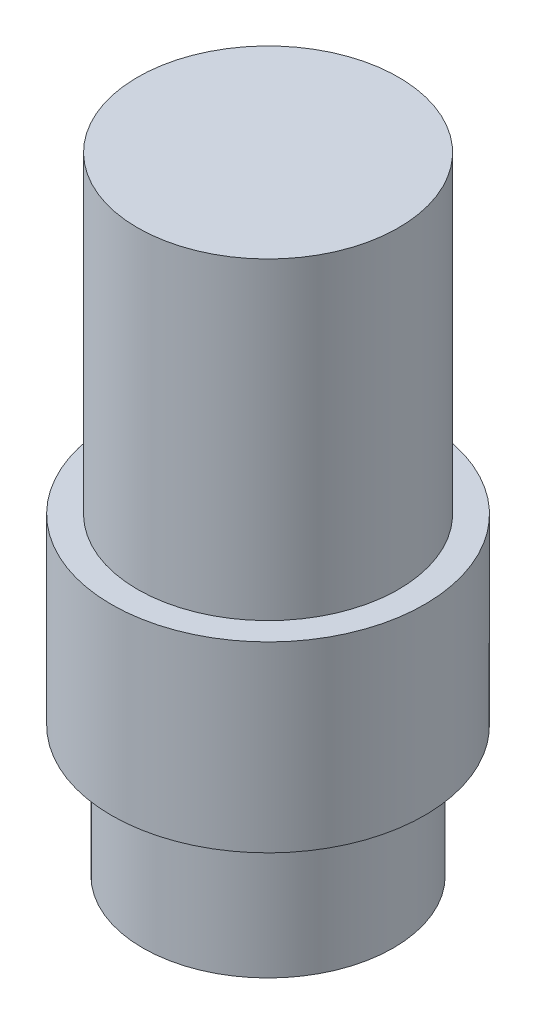
ISO-10303-21;
HEADER;
FILE_DESCRIPTION(('STEP AP214'),'2;1');
FILE_NAME('part.step','',(''),(''),'','','');
FILE_SCHEMA(('AUTOMOTIVE_DESIGN { 1 0 10303 214 1 1 1 1 }'));
ENDSEC;
DATA;
#1=APPLICATION_CONTEXT('core data for automotive mechanical design processes');
#2=APPLICATION_PROTOCOL_DEFINITION('international standard','automotive_design',2000,#1);
#3=PRODUCT_CONTEXT('',#1,'mechanical');
#4=PRODUCT('Part','Part','',(#3));
#5=PRODUCT_RELATED_PRODUCT_CATEGORY('part','',(#4));
#6=PRODUCT_DEFINITION_FORMATION('','',#4);
#7=PRODUCT_DEFINITION_CONTEXT('part definition',#1,'design');
#8=PRODUCT_DEFINITION('design','',#6,#7);
#9=PRODUCT_DEFINITION_SHAPE('','',#8);
#10=(LENGTH_UNIT() NAMED_UNIT(*) SI_UNIT(.MILLI.,.METRE.));
#11=(NAMED_UNIT(*) PLANE_ANGLE_UNIT() SI_UNIT($,.RADIAN.));
#12=(NAMED_UNIT(*) SI_UNIT($,.STERADIAN.) SOLID_ANGLE_UNIT());
#13=UNCERTAINTY_MEASURE_WITH_UNIT(LENGTH_MEASURE(1.E-05),#10,'distance_accuracy_value','');
#14=(GEOMETRIC_REPRESENTATION_CONTEXT(3) GLOBAL_UNCERTAINTY_ASSIGNED_CONTEXT((#13)) GLOBAL_UNIT_ASSIGNED_CONTEXT((#10,
#11,#12)) REPRESENTATION_CONTEXT('',''));
#15=CARTESIAN_POINT('',(0.,0.,0.));
#16=DIRECTION('',(0.,0.,1.));
#17=DIRECTION('',(1.,0.,0.));
#18=AXIS2_PLACEMENT_3D('',#15,#16,#17);
#19=CARTESIAN_POINT('',(0.,2.5,0.));
#20=DIRECTION('',(0.,-1.,0.));
#21=DIRECTION('',(0.,0.,-1.));
#22=AXIS2_PLACEMENT_3D('',#19,#20,#21);
#23=CYLINDRICAL_SURFACE('',#22,2.4);
#24=CARTESIAN_POINT('',(0.,2.5,0.));
#25=DIRECTION('',(0.,1.,0.));
#26=DIRECTION('',(0.,0.,1.));
#27=AXIS2_PLACEMENT_3D('',#24,#25,#26);
#28=CIRCLE('',#27,2.4);
#29=CARTESIAN_POINT('',(0.,2.5,2.4));
#30=VERTEX_POINT('',#29);
#31=EDGE_CURVE('E51',#30,#30,#28,.T.);
#32=ORIENTED_EDGE('',*,*,#31,.F.);
#33=EDGE_LOOP('',(#32));
#34=FACE_BOUND('',#33,.T.);
#35=CARTESIAN_POINT('',(0.,0.,0.));
#36=DIRECTION('',(0.,1.,0.));
#37=DIRECTION('',(0.,0.,1.));
#38=AXIS2_PLACEMENT_3D('',#35,#36,#37);
#39=CIRCLE('',#38,2.4);
#40=CARTESIAN_POINT('',(0.,0.,2.4));
#41=VERTEX_POINT('',#40);
#42=EDGE_CURVE('E46',#41,#41,#39,.T.);
#43=ORIENTED_EDGE('',*,*,#42,.T.);
#44=EDGE_LOOP('',(#43));
#45=FACE_BOUND('',#44,.T.);
#46=ADVANCED_FACE('F43',(#34,#45),#23,.T.);
#47=CARTESIAN_POINT('',(0.,0.,0.));
#48=DIRECTION('',(0.,1.,0.));
#49=DIRECTION('',(0.,0.,1.));
#50=AXIS2_PLACEMENT_3D('',#47,#48,#49);
#51=PLANE('',#50);
#52=ORIENTED_EDGE('',*,*,#42,.F.);
#53=EDGE_LOOP('',(#52));
#54=FACE_BOUND('',#53,.T.);
#55=ADVANCED_FACE('F90',(#54),#51,.F.);
#56=CARTESIAN_POINT('',(0.,6.,0.));
#57=DIRECTION('',(0.,-1.,0.));
#58=DIRECTION('',(0.,0.,-1.));
#59=AXIS2_PLACEMENT_3D('',#56,#57,#58);
#60=CYLINDRICAL_SURFACE('',#59,3.);
#61=CARTESIAN_POINT('',(0.,6.,0.));
#62=DIRECTION('',(0.,1.,0.));
#63=DIRECTION('',(0.,0.,1.));
#64=AXIS2_PLACEMENT_3D('',#61,#62,#63);
#65=CIRCLE('',#64,3.);
#66=CARTESIAN_POINT('',(0.,6.,3.));
#67=VERTEX_POINT('',#66);
#68=EDGE_CURVE('E60',#67,#67,#65,.T.);
#69=ORIENTED_EDGE('',*,*,#68,.F.);
#70=EDGE_LOOP('',(#69));
#71=FACE_BOUND('',#70,.T.);
#72=CARTESIAN_POINT('',(0.,2.5,0.));
#73=DIRECTION('',(0.,1.,0.));
#74=DIRECTION('',(0.,0.,1.));
#75=AXIS2_PLACEMENT_3D('',#72,#73,#74);
#76=CIRCLE('',#75,3.);
#77=CARTESIAN_POINT('',(0.,2.5,3.));
#78=VERTEX_POINT('',#77);
#79=EDGE_CURVE('E64',#78,#78,#76,.T.);
#80=ORIENTED_EDGE('',*,*,#79,.T.);
#81=EDGE_LOOP('',(#80));
#82=FACE_BOUND('',#81,.T.);
#83=ADVANCED_FACE('F95',(#71,#82),#60,.T.);
#84=CARTESIAN_POINT('',(0.,6.,0.));
#85=DIRECTION('',(0.,1.,0.));
#86=DIRECTION('',(0.,0.,1.));
#87=AXIS2_PLACEMENT_3D('',#84,#85,#86);
#88=PLANE('',#87);
#89=CARTESIAN_POINT('',(0.,6.,0.));
#90=DIRECTION('',(0.,1.,0.));
#91=DIRECTION('',(0.,0.,1.));
#92=AXIS2_PLACEMENT_3D('',#89,#90,#91);
#93=CIRCLE('',#92,2.5);
#94=CARTESIAN_POINT('',(0.,6.,2.5));
#95=VERTEX_POINT('',#94);
#96=EDGE_CURVE('E10',#95,#95,#93,.T.);
#97=ORIENTED_EDGE('',*,*,#96,.F.);
#98=EDGE_LOOP('',(#97));
#99=FACE_BOUND('',#98,.T.);
#100=ORIENTED_EDGE('',*,*,#68,.T.);
#101=EDGE_LOOP('',(#100));
#102=FACE_BOUND('',#101,.T.);
#103=ADVANCED_FACE('F85',(#99,#102),#88,.T.);
#104=CARTESIAN_POINT('',(0.,2.5,0.));
#105=DIRECTION('',(0.,1.,0.));
#106=DIRECTION('',(0.,0.,1.));
#107=AXIS2_PLACEMENT_3D('',#104,#105,#106);
#108=PLANE('',#107);
#109=ORIENTED_EDGE('',*,*,#31,.T.);
#110=EDGE_LOOP('',(#109));
#111=FACE_BOUND('',#110,.T.);
#112=ORIENTED_EDGE('',*,*,#79,.F.);
#113=EDGE_LOOP('',(#112));
#114=FACE_BOUND('',#113,.T.);
#115=ADVANCED_FACE('F77',(#111,#114),#108,.F.);
#116=CARTESIAN_POINT('',(0.,12.,0.));
#117=DIRECTION('',(0.,-1.,0.));
#118=DIRECTION('',(0.,0.,-1.));
#119=AXIS2_PLACEMENT_3D('',#116,#117,#118);
#120=CYLINDRICAL_SURFACE('',#119,2.5);
#121=CARTESIAN_POINT('',(0.,12.,0.));
#122=DIRECTION('',(0.,1.,0.));
#123=DIRECTION('',(0.,0.,1.));
#124=AXIS2_PLACEMENT_3D('',#121,#122,#123);
#125=CIRCLE('',#124,2.5);
#126=CARTESIAN_POINT('',(0.,12.,2.5));
#127=VERTEX_POINT('',#126);
#128=EDGE_CURVE('E59',#127,#127,#125,.T.);
#129=ORIENTED_EDGE('',*,*,#128,.F.);
#130=EDGE_LOOP('',(#129));
#131=FACE_BOUND('',#130,.T.);
#132=ORIENTED_EDGE('',*,*,#96,.T.);
#133=EDGE_LOOP('',(#132));
#134=FACE_BOUND('',#133,.T.);
#135=ADVANCED_FACE('F75',(#131,#134),#120,.T.);
#136=CARTESIAN_POINT('',(0.,12.,0.));
#137=DIRECTION('',(0.,1.,0.));
#138=DIRECTION('',(0.,0.,1.));
#139=AXIS2_PLACEMENT_3D('',#136,#137,#138);
#140=PLANE('',#139);
#141=ORIENTED_EDGE('',*,*,#128,.T.);
#142=EDGE_LOOP('',(#141));
#143=FACE_BOUND('',#142,.T.);
#144=ADVANCED_FACE('F73',(#143),#140,.T.);
#145=CLOSED_SHELL('',(#46,#55,#83,#103,#115,#135,#144));
#146=MANIFOLD_SOLID_BREP('B2',#145);
#147=ADVANCED_BREP_SHAPE_REPRESENTATION('',(#18,#146),#14);
#148=SHAPE_DEFINITION_REPRESENTATION(#9,#147);
ENDSEC;
END-ISO-10303-21;
